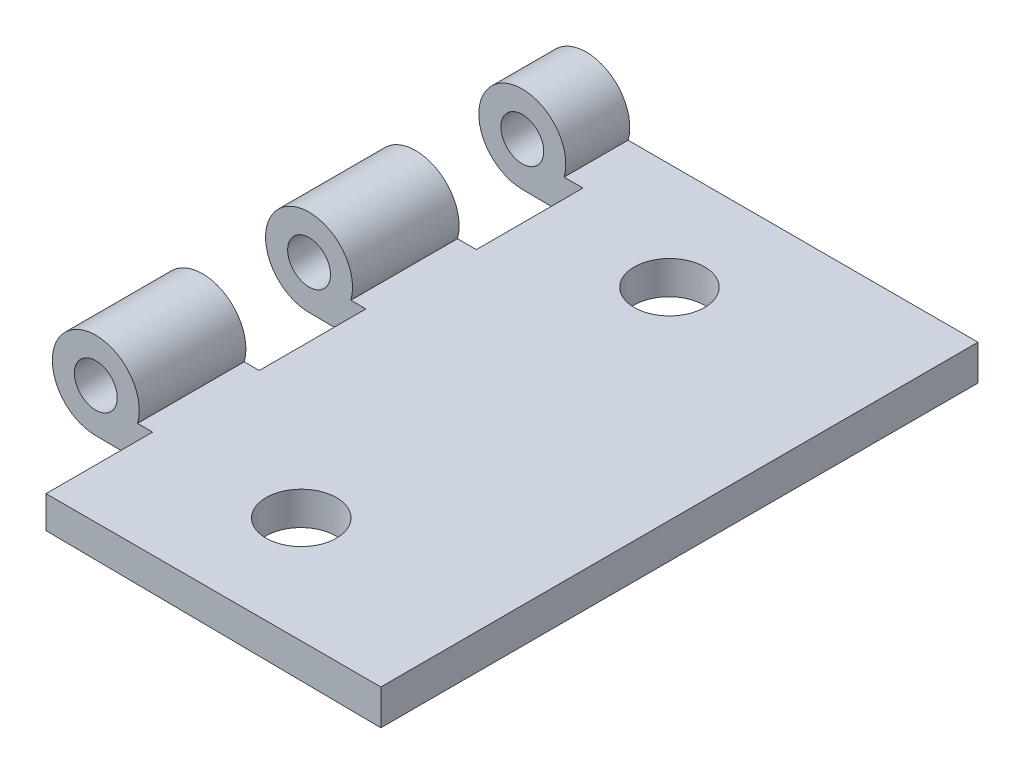
ISO-10303-21;
HEADER;
FILE_DESCRIPTION(('STEP AP214'),'2;1');
FILE_NAME('part.step','',(''),(''),'','','');
FILE_SCHEMA(('AUTOMOTIVE_DESIGN { 1 0 10303 214 1 1 1 1 }'));
ENDSEC;
DATA;
#1=APPLICATION_CONTEXT('core data for automotive mechanical design processes');
#2=APPLICATION_PROTOCOL_DEFINITION('international standard','automotive_design',2000,#1);
#3=PRODUCT_CONTEXT('',#1,'mechanical');
#4=PRODUCT('Part','Part','',(#3));
#5=PRODUCT_RELATED_PRODUCT_CATEGORY('part','',(#4));
#6=PRODUCT_DEFINITION_FORMATION('','',#4);
#7=PRODUCT_DEFINITION_CONTEXT('part definition',#1,'design');
#8=PRODUCT_DEFINITION('design','',#6,#7);
#9=PRODUCT_DEFINITION_SHAPE('','',#8);
#10=(LENGTH_UNIT() NAMED_UNIT(*) SI_UNIT(.MILLI.,.METRE.));
#11=(NAMED_UNIT(*) PLANE_ANGLE_UNIT() SI_UNIT($,.RADIAN.));
#12=(NAMED_UNIT(*) SI_UNIT($,.STERADIAN.) SOLID_ANGLE_UNIT());
#13=UNCERTAINTY_MEASURE_WITH_UNIT(LENGTH_MEASURE(1.E-05),#10,'distance_accuracy_value','');
#14=(GEOMETRIC_REPRESENTATION_CONTEXT(3) GLOBAL_UNCERTAINTY_ASSIGNED_CONTEXT((#13)) GLOBAL_UNIT_ASSIGNED_CONTEXT((#10,
#11,#12)) REPRESENTATION_CONTEXT('',''));
#15=CARTESIAN_POINT('',(0.,0.,0.));
#16=DIRECTION('',(0.,0.,1.));
#17=DIRECTION('',(1.,0.,0.));
#18=AXIS2_PLACEMENT_3D('',#15,#16,#17);
#19=CARTESIAN_POINT('',(0.,0.,280.));
#20=DIRECTION('',(0.,0.,1.));
#21=DIRECTION('',(1.,0.,0.));
#22=AXIS2_PLACEMENT_3D('',#19,#20,#21);
#23=PLANE('',#22);
#24=DIRECTION('',(-1.,0.,0.));
#25=VECTOR('',#24,1.);
#26=CARTESIAN_POINT('',(183.674687945951,-5.61723560223056,280.));
#27=LINE('',#26,#25);
#28=CARTESIAN_POINT('',(183.674687945951,-5.61723560223056,280.));
#29=VERTEX_POINT('',#28);
#30=CARTESIAN_POINT('',(26.6531917692704,-5.61723560223056,280.));
#31=VERTEX_POINT('',#30);
#32=EDGE_CURVE('E223',#29,#31,#27,.T.);
#33=ORIENTED_EDGE('',*,*,#32,.T.);
#34=DIRECTION('',(0.,1.,0.));
#35=VECTOR('',#34,1.);
#36=CARTESIAN_POINT('',(26.6531917692704,-22.2014549992922,280.));
#37=LINE('',#36,#35);
#38=CARTESIAN_POINT('',(26.6531917692704,-20.6503256305082,280.));
#39=VERTEX_POINT('',#38);
#40=EDGE_CURVE('E300',#39,#31,#37,.T.);
#41=ORIENTED_EDGE('',*,*,#40,.F.);
#42=DIRECTION('',(0.999951211660215,-0.00987797040229495,0.));
#43=VECTOR('',#42,1.);
#44=CARTESIAN_POINT('',(0.,-20.3870333454912,280.));
#45=LINE('',#44,#43);
#46=CARTESIAN_POINT('',(183.674687945951,-22.2014549992922,280.));
#47=VERTEX_POINT('',#46);
#48=EDGE_CURVE('E228',#39,#47,#45,.T.);
#49=ORIENTED_EDGE('',*,*,#48,.T.);
#50=DIRECTION('',(0.,1.,0.));
#51=VECTOR('',#50,1.);
#52=CARTESIAN_POINT('',(183.674687945951,-22.2014549992922,280.));
#53=LINE('',#52,#51);
#54=EDGE_CURVE('E219',#47,#29,#53,.T.);
#55=ORIENTED_EDGE('',*,*,#54,.T.);
#56=EDGE_LOOP('',(#33,#41,#49,#55));
#57=FACE_BOUND('',#56,.T.);
#58=ADVANCED_FACE('F59',(#57),#23,.T.);
#59=CARTESIAN_POINT('',(183.674687945951,-5.61723560223056,280.));
#60=DIRECTION('',(0.,-1.,0.));
#61=DIRECTION('',(0.,0.,-1.));
#62=AXIS2_PLACEMENT_3D('',#59,#60,#61);
#63=PLANE('',#62);
#64=CARTESIAN_POINT('',(96.3509650637546,-5.61723560223056,230.));
#65=DIRECTION('',(0.,1.,0.));
#66=DIRECTION('',(0.,0.,1.));
#67=AXIS2_PLACEMENT_3D('',#64,#65,#66);
#68=CIRCLE('',#67,16.5051294754292);
#69=CARTESIAN_POINT('',(96.3509650637546,-5.61723560223056,246.505129475429));
#70=VERTEX_POINT('',#69);
#71=EDGE_CURVE('E204',#70,#70,#68,.T.);
#72=ORIENTED_EDGE('',*,*,#71,.F.);
#73=EDGE_LOOP('',(#72));
#74=FACE_BOUND('',#73,.T.);
#75=CARTESIAN_POINT('',(88.9973961819924,-5.61723560223056,50.));
#76=DIRECTION('',(0.,1.,0.));
#77=DIRECTION('',(0.,0.,1.));
#78=AXIS2_PLACEMENT_3D('',#75,#76,#77);
#79=CIRCLE('',#78,16.5051294754292);
#80=CARTESIAN_POINT('',(88.9973961819924,-5.61723560223056,66.5051294754292));
#81=VERTEX_POINT('',#80);
#82=EDGE_CURVE('E205',#81,#81,#79,.T.);
#83=ORIENTED_EDGE('',*,*,#82,.F.);
#84=EDGE_LOOP('',(#83));
#85=FACE_BOUND('',#84,.T.);
#86=DIRECTION('',(-1.,0.,0.));
#87=VECTOR('',#86,1.);
#88=CARTESIAN_POINT('',(183.674687945951,-5.61723560223056,30.0000000000001));
#89=LINE('',#88,#87);
#90=CARTESIAN_POINT('',(28.4519508754233,-5.61723560223056,30.));
#91=VERTEX_POINT('',#90);
#92=CARTESIAN_POINT('',(19.597902765837,-5.61723560223056,30.0000000000001));
#93=VERTEX_POINT('',#92);
#94=EDGE_CURVE('E192',#91,#93,#89,.T.);
#95=ORIENTED_EDGE('',*,*,#94,.F.);
#96=DIRECTION('',(0.,0.,-1.));
#97=VECTOR('',#96,1.);
#98=CARTESIAN_POINT('',(28.4519508754233,-5.61723560223056,280.));
#99=LINE('',#98,#97);
#100=CARTESIAN_POINT('',(28.4519508754233,-5.61723560223056,80.0000000000001));
#101=VERTEX_POINT('',#100);
#102=EDGE_CURVE('E196',#101,#91,#99,.T.);
#103=ORIENTED_EDGE('',*,*,#102,.F.);
#104=DIRECTION('',(-1.,0.,0.));
#105=VECTOR('',#104,1.);
#106=CARTESIAN_POINT('',(183.674687945951,-5.61723560223056,80.0000000000001));
#107=LINE('',#106,#105);
#108=CARTESIAN_POINT('',(19.597902765837,-5.61723560223056,80.0000000000001));
#109=VERTEX_POINT('',#108);
#110=EDGE_CURVE('E294',#101,#109,#107,.T.);
#111=ORIENTED_EDGE('',*,*,#110,.T.);
#112=DIRECTION('',(0.,0.,-1.));
#113=VECTOR('',#112,1.);
#114=CARTESIAN_POINT('',(19.597902765837,-5.61723560223056,280.));
#115=LINE('',#114,#113);
#116=CARTESIAN_POINT('',(19.597902765837,-5.61723560223056,130.));
#117=VERTEX_POINT('',#116);
#118=EDGE_CURVE('E256',#117,#109,#115,.T.);
#119=ORIENTED_EDGE('',*,*,#118,.F.);
#120=DIRECTION('',(-1.,0.,0.));
#121=VECTOR('',#120,1.);
#122=CARTESIAN_POINT('',(183.674687945951,-5.61723560223056,130.));
#123=LINE('',#122,#121);
#124=CARTESIAN_POINT('',(26.6531917692704,-5.61723560223056,130.));
#125=VERTEX_POINT('',#124);
#126=EDGE_CURVE('E189',#125,#117,#123,.T.);
#127=ORIENTED_EDGE('',*,*,#126,.F.);
#128=DIRECTION('',(0.,0.,-1.));
#129=VECTOR('',#128,1.);
#130=CARTESIAN_POINT('',(26.6531917692704,-5.61723560223056,280.));
#131=LINE('',#130,#129);
#132=CARTESIAN_POINT('',(26.6531917692704,-5.61723560223056,180.));
#133=VERTEX_POINT('',#132);
#134=EDGE_CURVE('E177',#133,#125,#131,.T.);
#135=ORIENTED_EDGE('',*,*,#134,.F.);
#136=DIRECTION('',(-1.,0.,0.));
#137=VECTOR('',#136,1.);
#138=CARTESIAN_POINT('',(183.674687945951,-5.61723560223056,180.));
#139=LINE('',#138,#137);
#140=CARTESIAN_POINT('',(19.597902765837,-5.61723560223056,180.));
#141=VERTEX_POINT('',#140);
#142=EDGE_CURVE('E160',#133,#141,#139,.T.);
#143=ORIENTED_EDGE('',*,*,#142,.T.);
#144=CARTESIAN_POINT('',(19.597902765837,-5.61723560223056,230.));
#145=VERTEX_POINT('',#144);
#146=EDGE_CURVE('E257',#145,#141,#115,.T.);
#147=ORIENTED_EDGE('',*,*,#146,.F.);
#148=DIRECTION('',(-1.,0.,0.));
#149=VECTOR('',#148,1.);
#150=CARTESIAN_POINT('',(183.674687945951,-5.61723560223056,230.));
#151=LINE('',#150,#149);
#152=CARTESIAN_POINT('',(26.6531917692704,-5.61723560223056,230.));
#153=VERTEX_POINT('',#152);
#154=EDGE_CURVE('E288',#153,#145,#151,.T.);
#155=ORIENTED_EDGE('',*,*,#154,.F.);
#156=DIRECTION('',(0.,0.,-1.));
#157=VECTOR('',#156,1.);
#158=CARTESIAN_POINT('',(26.6531917692704,-5.61723560223056,280.));
#159=LINE('',#158,#157);
#160=EDGE_CURVE('E191',#31,#153,#159,.T.);
#161=ORIENTED_EDGE('',*,*,#160,.F.);
#162=ORIENTED_EDGE('',*,*,#32,.F.);
#163=DIRECTION('',(0.,0.,-1.));
#164=VECTOR('',#163,1.);
#165=CARTESIAN_POINT('',(183.674687945951,-5.61723560223056,280.));
#166=LINE('',#165,#164);
#167=CARTESIAN_POINT('',(183.674687945951,-5.61723560223056,0.));
#168=VERTEX_POINT('',#167);
#169=EDGE_CURVE('E258',#29,#168,#166,.T.);
#170=ORIENTED_EDGE('',*,*,#169,.T.);
#171=DIRECTION('',(-1.,0.,0.));
#172=VECTOR('',#171,1.);
#173=CARTESIAN_POINT('',(183.674687945951,-5.61723560223056,0.));
#174=LINE('',#173,#172);
#175=CARTESIAN_POINT('',(19.597902765837,-5.61723560223056,0.));
#176=VERTEX_POINT('',#175);
#177=EDGE_CURVE('E235',#168,#176,#174,.T.);
#178=ORIENTED_EDGE('',*,*,#177,.T.);
#179=EDGE_CURVE('E253',#93,#176,#115,.T.);
#180=ORIENTED_EDGE('',*,*,#179,.F.);
#181=EDGE_LOOP('',(#95,#103,#111,#119,#127,#135,#143,#147,#155,#161,#162,#170,#178,#180));
#182=FACE_BOUND('',#181,.T.);
#183=ADVANCED_FACE('F187',(#74,#85,#182),#63,.F.);
#184=CARTESIAN_POINT('',(0.,0.,280.));
#185=DIRECTION('',(0.,0.,-1.));
#186=DIRECTION('',(-1.,0.,0.));
#187=AXIS2_PLACEMENT_3D('',#184,#185,#186);
#188=CYLINDRICAL_SURFACE('',#187,20.3870333454912);
#189=DIRECTION('',(0.,0.,-1.));
#190=VECTOR('',#189,1.);
#191=CARTESIAN_POINT('',(0.,-20.3870333454912,280.));
#192=LINE('',#191,#190);
#193=CARTESIAN_POINT('',(0.,-20.3870333454912,30.0000000000001));
#194=VERTEX_POINT('',#193);
#195=CARTESIAN_POINT('',(0.,-20.3870333454912,0.));
#196=VERTEX_POINT('',#195);
#197=EDGE_CURVE('E248',#194,#196,#192,.T.);
#198=ORIENTED_EDGE('',*,*,#197,.F.);
#199=CARTESIAN_POINT('',(0.,0.,30.0000000000001));
#200=DIRECTION('',(0.,0.,1.));
#201=DIRECTION('',(1.,0.,0.));
#202=AXIS2_PLACEMENT_3D('',#199,#200,#201);
#203=CIRCLE('',#202,20.3870333454912);
#204=EDGE_CURVE('E198',#93,#194,#203,.T.);
#205=ORIENTED_EDGE('',*,*,#204,.F.);
#206=ORIENTED_EDGE('',*,*,#179,.T.);
#207=CARTESIAN_POINT('',(0.,0.,0.));
#208=DIRECTION('',(0.,0.,1.));
#209=DIRECTION('',(1.,0.,0.));
#210=AXIS2_PLACEMENT_3D('',#207,#208,#209);
#211=CIRCLE('',#210,20.3870333454912);
#212=EDGE_CURVE('E239',#176,#196,#211,.T.);
#213=ORIENTED_EDGE('',*,*,#212,.T.);
#214=EDGE_LOOP('',(#198,#205,#206,#213));
#215=FACE_BOUND('',#214,.T.);
#216=ADVANCED_FACE('F365',(#215),#188,.T.);
#217=CARTESIAN_POINT('',(0.,0.,80.0000000000001));
#218=DIRECTION('',(0.,0.,1.));
#219=DIRECTION('',(1.,0.,0.));
#220=AXIS2_PLACEMENT_3D('',#217,#218,#219);
#221=CIRCLE('',#220,20.3870333454912);
#222=CARTESIAN_POINT('',(0.,-20.3870333454912,80.0000000000001));
#223=VERTEX_POINT('',#222);
#224=EDGE_CURVE('E349',#109,#223,#221,.T.);
#225=ORIENTED_EDGE('',*,*,#224,.T.);
#226=CARTESIAN_POINT('',(0.,-20.3870333454912,130.));
#227=VERTEX_POINT('',#226);
#228=EDGE_CURVE('E251',#227,#223,#192,.T.);
#229=ORIENTED_EDGE('',*,*,#228,.F.);
#230=CARTESIAN_POINT('',(0.,0.,130.));
#231=DIRECTION('',(0.,0.,1.));
#232=DIRECTION('',(1.,0.,0.));
#233=AXIS2_PLACEMENT_3D('',#230,#231,#232);
#234=CIRCLE('',#233,20.3870333454912);
#235=EDGE_CURVE('E334',#117,#227,#234,.T.);
#236=ORIENTED_EDGE('',*,*,#235,.F.);
#237=ORIENTED_EDGE('',*,*,#118,.T.);
#238=EDGE_LOOP('',(#225,#229,#236,#237));
#239=FACE_BOUND('',#238,.T.);
#240=ADVANCED_FACE('F407',(#239),#188,.T.);
#241=CARTESIAN_POINT('',(0.,-20.3870333454912,230.));
#242=VERTEX_POINT('',#241);
#243=CARTESIAN_POINT('',(0.,-20.3870333454912,180.));
#244=VERTEX_POINT('',#243);
#245=EDGE_CURVE('E252',#242,#244,#192,.T.);
#246=ORIENTED_EDGE('',*,*,#245,.F.);
#247=CARTESIAN_POINT('',(0.,0.,230.));
#248=DIRECTION('',(0.,0.,1.));
#249=DIRECTION('',(1.,0.,0.));
#250=AXIS2_PLACEMENT_3D('',#247,#248,#249);
#251=CIRCLE('',#250,20.3870333454912);
#252=EDGE_CURVE('E341',#145,#242,#251,.T.);
#253=ORIENTED_EDGE('',*,*,#252,.F.);
#254=ORIENTED_EDGE('',*,*,#146,.T.);
#255=CARTESIAN_POINT('',(0.,0.,180.));
#256=DIRECTION('',(0.,0.,1.));
#257=DIRECTION('',(1.,0.,0.));
#258=AXIS2_PLACEMENT_3D('',#255,#256,#257);
#259=CIRCLE('',#258,20.3870333454912);
#260=EDGE_CURVE('E166',#141,#244,#259,.T.);
#261=ORIENTED_EDGE('',*,*,#260,.T.);
#262=EDGE_LOOP('',(#246,#253,#254,#261));
#263=FACE_BOUND('',#262,.T.);
#264=ADVANCED_FACE('F404',(#263),#188,.T.);
#265=CARTESIAN_POINT('',(0.,-20.3870333454912,280.));
#266=DIRECTION('',(0.00987797040229495,0.999951211660215,0.));
#267=DIRECTION('',(-0.999951211660215,0.00987797040229494,0.));
#268=AXIS2_PLACEMENT_3D('',#265,#266,#267);
#269=PLANE('',#268);
#270=CARTESIAN_POINT('',(96.3509650637546,-21.3388317632881,230.));
#271=DIRECTION('',(0.00987797040229495,0.999951211660215,0.));
#272=DIRECTION('',(-0.999951211660215,0.00987797040229494,0.));
#273=AXIS2_PLACEMENT_3D('',#270,#271,#272);
#274=ELLIPSE('',#273,16.5059347725834,16.5051294754292);
#275=CARTESIAN_POINT('',(79.8458355883254,-21.1757866281423,230.));
#276=VERTEX_POINT('',#275);
#277=EDGE_CURVE('E209',#276,#276,#274,.T.);
#278=ORIENTED_EDGE('',*,*,#277,.T.);
#279=EDGE_LOOP('',(#278));
#280=FACE_BOUND('',#279,.T.);
#281=CARTESIAN_POINT('',(88.9973961819924,-21.2661898834461,50.));
#282=DIRECTION('',(0.00987797040229495,0.999951211660215,0.));
#283=DIRECTION('',(-0.999951211660215,0.00987797040229494,0.));
#284=AXIS2_PLACEMENT_3D('',#281,#282,#283);
#285=ELLIPSE('',#284,16.5059347725834,16.5051294754292);
#286=CARTESIAN_POINT('',(72.4922667065631,-21.1031447483003,50.));
#287=VERTEX_POINT('',#286);
#288=EDGE_CURVE('E218',#287,#287,#285,.T.);
#289=ORIENTED_EDGE('',*,*,#288,.T.);
#290=EDGE_LOOP('',(#289));
#291=FACE_BOUND('',#290,.T.);
#292=DIRECTION('',(0.999951211660215,-0.00987797040229494,0.));
#293=VECTOR('',#292,1.);
#294=CARTESIAN_POINT('',(0.,-20.3870333454912,30.0000000000001));
#295=LINE('',#294,#293);
#296=CARTESIAN_POINT('',(28.4519508754233,-20.6680945866375,30.));
#297=VERTEX_POINT('',#296);
#298=EDGE_CURVE('E293',#194,#297,#295,.T.);
#299=ORIENTED_EDGE('',*,*,#298,.F.);
#300=ORIENTED_EDGE('',*,*,#197,.T.);
#301=DIRECTION('',(0.999951211660215,-0.00987797040229495,0.));
#302=VECTOR('',#301,1.);
#303=CARTESIAN_POINT('',(0.,-20.3870333454912,0.));
#304=LINE('',#303,#302);
#305=CARTESIAN_POINT('',(183.674687945951,-22.2014549992922,0.));
#306=VERTEX_POINT('',#305);
#307=EDGE_CURVE('E224',#196,#306,#304,.T.);
#308=ORIENTED_EDGE('',*,*,#307,.T.);
#309=DIRECTION('',(0.,0.,-1.));
#310=VECTOR('',#309,1.);
#311=CARTESIAN_POINT('',(183.674687945951,-22.2014549992922,280.));
#312=LINE('',#311,#310);
#313=EDGE_CURVE('E231',#47,#306,#312,.T.);
#314=ORIENTED_EDGE('',*,*,#313,.F.);
#315=ORIENTED_EDGE('',*,*,#48,.F.);
#316=DIRECTION('',(0.,0.,1.));
#317=VECTOR('',#316,1.);
#318=CARTESIAN_POINT('',(26.6531917692704,-20.6503256305082,280.));
#319=LINE('',#318,#317);
#320=CARTESIAN_POINT('',(26.6531917692704,-20.6503256305082,230.));
#321=VERTEX_POINT('',#320);
#322=EDGE_CURVE('E68',#321,#39,#319,.T.);
#323=ORIENTED_EDGE('',*,*,#322,.F.);
#324=DIRECTION('',(0.999951211660215,-0.00987797040229494,0.));
#325=VECTOR('',#324,1.);
#326=CARTESIAN_POINT('',(0.,-20.3870333454912,230.));
#327=LINE('',#326,#325);
#328=EDGE_CURVE('E282',#242,#321,#327,.T.);
#329=ORIENTED_EDGE('',*,*,#328,.F.);
#330=ORIENTED_EDGE('',*,*,#245,.T.);
#331=DIRECTION('',(0.999951211660215,-0.00987797040229494,0.));
#332=VECTOR('',#331,1.);
#333=CARTESIAN_POINT('',(0.,-20.3870333454912,180.));
#334=LINE('',#333,#332);
#335=CARTESIAN_POINT('',(26.6531917692704,-20.6503256305082,180.));
#336=VERTEX_POINT('',#335);
#337=EDGE_CURVE('E272',#244,#336,#334,.T.);
#338=ORIENTED_EDGE('',*,*,#337,.T.);
#339=DIRECTION('',(0.,0.,1.));
#340=VECTOR('',#339,1.);
#341=CARTESIAN_POINT('',(26.6531917692704,-20.6503256305082,280.));
#342=LINE('',#341,#340);
#343=CARTESIAN_POINT('',(26.6531917692704,-20.6503256305082,130.));
#344=VERTEX_POINT('',#343);
#345=EDGE_CURVE('E180',#344,#336,#342,.T.);
#346=ORIENTED_EDGE('',*,*,#345,.F.);
#347=DIRECTION('',(0.999951211660215,-0.00987797040229494,0.));
#348=VECTOR('',#347,1.);
#349=CARTESIAN_POINT('',(0.,-20.3870333454912,130.));
#350=LINE('',#349,#348);
#351=EDGE_CURVE('E277',#227,#344,#350,.T.);
#352=ORIENTED_EDGE('',*,*,#351,.F.);
#353=ORIENTED_EDGE('',*,*,#228,.T.);
#354=DIRECTION('',(0.999951211660215,-0.00987797040229494,0.));
#355=VECTOR('',#354,1.);
#356=CARTESIAN_POINT('',(0.,-20.3870333454912,80.0000000000001));
#357=LINE('',#356,#355);
#358=CARTESIAN_POINT('',(28.4519508754233,-20.6680945866375,80.0000000000001));
#359=VERTEX_POINT('',#358);
#360=EDGE_CURVE('E287',#223,#359,#357,.T.);
#361=ORIENTED_EDGE('',*,*,#360,.T.);
#362=DIRECTION('',(0.,0.,1.));
#363=VECTOR('',#362,1.);
#364=CARTESIAN_POINT('',(28.4519508754233,-20.6680945866375,280.));
#365=LINE('',#364,#363);
#366=EDGE_CURVE('E12',#297,#359,#365,.T.);
#367=ORIENTED_EDGE('',*,*,#366,.F.);
#368=EDGE_LOOP('',(#299,#300,#308,#314,#315,#323,#329,#330,#338,#346,#352,#353,#361,#367));
#369=FACE_BOUND('',#368,.T.);
#370=ADVANCED_FACE('F310',(#280,#291,#369),#269,.F.);
#371=CARTESIAN_POINT('',(0.,0.,280.));
#372=DIRECTION('',(0.,0.,-1.));
#373=DIRECTION('',(-1.,0.,0.));
#374=AXIS2_PLACEMENT_3D('',#371,#372,#373);
#375=CYLINDRICAL_SURFACE('',#374,10.0437475691042);
#376=CARTESIAN_POINT('',(0.,0.,0.));
#377=DIRECTION('',(0.,0.,1.));
#378=DIRECTION('',(1.,0.,0.));
#379=AXIS2_PLACEMENT_3D('',#376,#377,#378);
#380=CIRCLE('',#379,10.0437475691042);
#381=CARTESIAN_POINT('',(10.0437475691042,0.,0.));
#382=VERTEX_POINT('',#381);
#383=EDGE_CURVE('E213',#382,#382,#380,.T.);
#384=ORIENTED_EDGE('',*,*,#383,.F.);
#385=EDGE_LOOP('',(#384));
#386=FACE_BOUND('',#385,.T.);
#387=CARTESIAN_POINT('',(0.,0.,30.0000000000001));
#388=DIRECTION('',(0.,0.,1.));
#389=DIRECTION('',(1.,0.,0.));
#390=AXIS2_PLACEMENT_3D('',#387,#388,#389);
#391=CIRCLE('',#390,10.0437475691042);
#392=CARTESIAN_POINT('',(10.0437475691042,0.,30.0000000000001));
#393=VERTEX_POINT('',#392);
#394=EDGE_CURVE('E289',#393,#393,#391,.T.);
#395=ORIENTED_EDGE('',*,*,#394,.T.);
#396=EDGE_LOOP('',(#395));
#397=FACE_BOUND('',#396,.T.);
#398=ADVANCED_FACE('F370',(#386,#397),#375,.F.);
#399=CARTESIAN_POINT('',(0.,0.,0.));
#400=DIRECTION('',(0.,0.,1.));
#401=DIRECTION('',(1.,0.,0.));
#402=AXIS2_PLACEMENT_3D('',#399,#400,#401);
#403=PLANE('',#402);
#404=DIRECTION('',(0.,1.,0.));
#405=VECTOR('',#404,1.);
#406=CARTESIAN_POINT('',(183.674687945951,-22.2014549992922,0.));
#407=LINE('',#406,#405);
#408=EDGE_CURVE('E217',#306,#168,#407,.T.);
#409=ORIENTED_EDGE('',*,*,#408,.F.);
#410=ORIENTED_EDGE('',*,*,#307,.F.);
#411=ORIENTED_EDGE('',*,*,#212,.F.);
#412=ORIENTED_EDGE('',*,*,#177,.F.);
#413=EDGE_LOOP('',(#409,#410,#411,#412));
#414=FACE_BOUND('',#413,.T.);
#415=ORIENTED_EDGE('',*,*,#383,.T.);
#416=EDGE_LOOP('',(#415));
#417=FACE_BOUND('',#416,.T.);
#418=ADVANCED_FACE('F367',(#414,#417),#403,.F.);
#419=CARTESIAN_POINT('',(183.674687945951,-22.2014549992922,280.));
#420=DIRECTION('',(-1.,0.,0.));
#421=DIRECTION('',(0.,0.,1.));
#422=AXIS2_PLACEMENT_3D('',#419,#420,#421);
#423=PLANE('',#422);
#424=ORIENTED_EDGE('',*,*,#408,.T.);
#425=ORIENTED_EDGE('',*,*,#169,.F.);
#426=ORIENTED_EDGE('',*,*,#54,.F.);
#427=ORIENTED_EDGE('',*,*,#313,.T.);
#428=EDGE_LOOP('',(#424,#425,#426,#427));
#429=FACE_BOUND('',#428,.T.);
#430=ADVANCED_FACE('F61',(#429),#423,.F.);
#431=CARTESIAN_POINT('',(96.3509650637546,-22.2014549992922,230.));
#432=DIRECTION('',(0.,1.,0.));
#433=DIRECTION('',(0.,0.,1.));
#434=AXIS2_PLACEMENT_3D('',#431,#432,#433);
#435=CYLINDRICAL_SURFACE('',#434,16.5051294754292);
#436=ORIENTED_EDGE('',*,*,#71,.T.);
#437=EDGE_LOOP('',(#436));
#438=FACE_BOUND('',#437,.T.);
#439=ORIENTED_EDGE('',*,*,#277,.F.);
#440=EDGE_LOOP('',(#439));
#441=FACE_BOUND('',#440,.T.);
#442=ADVANCED_FACE('F448',(#438,#441),#435,.F.);
#443=CARTESIAN_POINT('',(88.9973961819924,-22.2014549992922,50.));
#444=DIRECTION('',(0.,1.,0.));
#445=DIRECTION('',(0.,0.,1.));
#446=AXIS2_PLACEMENT_3D('',#443,#444,#445);
#447=CYLINDRICAL_SURFACE('',#446,16.5051294754292);
#448=ORIENTED_EDGE('',*,*,#82,.T.);
#449=EDGE_LOOP('',(#448));
#450=FACE_BOUND('',#449,.T.);
#451=ORIENTED_EDGE('',*,*,#288,.F.);
#452=EDGE_LOOP('',(#451));
#453=FACE_BOUND('',#452,.T.);
#454=ADVANCED_FACE('F442',(#450,#453),#447,.F.);
#455=CARTESIAN_POINT('',(26.6531917692704,-22.2014549992922,130.));
#456=DIRECTION('',(-1.,0.,0.));
#457=DIRECTION('',(0.,0.,1.));
#458=AXIS2_PLACEMENT_3D('',#455,#456,#457);
#459=PLANE('',#458);
#460=ORIENTED_EDGE('',*,*,#134,.T.);
#461=DIRECTION('',(0.,1.,0.));
#462=VECTOR('',#461,1.);
#463=CARTESIAN_POINT('',(26.6531917692704,-22.2014549992922,130.));
#464=LINE('',#463,#462);
#465=EDGE_CURVE('E183',#344,#125,#464,.T.);
#466=ORIENTED_EDGE('',*,*,#465,.F.);
#467=ORIENTED_EDGE('',*,*,#345,.T.);
#468=DIRECTION('',(0.,1.,0.));
#469=VECTOR('',#468,1.);
#470=CARTESIAN_POINT('',(26.6531917692704,-22.2014549992922,180.));
#471=LINE('',#470,#469);
#472=EDGE_CURVE('E164',#336,#133,#471,.T.);
#473=ORIENTED_EDGE('',*,*,#472,.T.);
#474=EDGE_LOOP('',(#460,#466,#467,#473));
#475=FACE_BOUND('',#474,.T.);
#476=ADVANCED_FACE('F175',(#475),#459,.T.);
#477=CARTESIAN_POINT('',(-42.2135854377259,-22.2014549992922,130.));
#478=DIRECTION('',(0.,0.,1.));
#479=DIRECTION('',(1.,0.,0.));
#480=AXIS2_PLACEMENT_3D('',#477,#478,#479);
#481=PLANE('',#480);
#482=CARTESIAN_POINT('',(0.,0.,130.));
#483=DIRECTION('',(0.,0.,1.));
#484=DIRECTION('',(1.,0.,0.));
#485=AXIS2_PLACEMENT_3D('',#482,#483,#484);
#486=CIRCLE('',#485,10.0437475691042);
#487=CARTESIAN_POINT('',(10.0437475691042,0.,130.));
#488=VERTEX_POINT('',#487);
#489=EDGE_CURVE('E172',#488,#488,#486,.T.);
#490=ORIENTED_EDGE('',*,*,#489,.F.);
#491=EDGE_LOOP('',(#490));
#492=FACE_BOUND('',#491,.T.);
#493=ORIENTED_EDGE('',*,*,#126,.T.);
#494=ORIENTED_EDGE('',*,*,#235,.T.);
#495=ORIENTED_EDGE('',*,*,#351,.T.);
#496=ORIENTED_EDGE('',*,*,#465,.T.);
#497=EDGE_LOOP('',(#493,#494,#495,#496));
#498=FACE_BOUND('',#497,.T.);
#499=ADVANCED_FACE('F432',(#492,#498),#481,.T.);
#500=CARTESIAN_POINT('',(-42.2135854377259,-22.2014549992922,180.));
#501=DIRECTION('',(0.,0.,1.));
#502=DIRECTION('',(1.,0.,0.));
#503=AXIS2_PLACEMENT_3D('',#500,#501,#502);
#504=PLANE('',#503);
#505=CARTESIAN_POINT('',(0.,0.,180.));
#506=DIRECTION('',(0.,0.,1.));
#507=DIRECTION('',(1.,0.,0.));
#508=AXIS2_PLACEMENT_3D('',#505,#506,#507);
#509=CIRCLE('',#508,10.0437475691042);
#510=CARTESIAN_POINT('',(10.0437475691042,0.,180.));
#511=VERTEX_POINT('',#510);
#512=EDGE_CURVE('E268',#511,#511,#509,.T.);
#513=ORIENTED_EDGE('',*,*,#512,.T.);
#514=EDGE_LOOP('',(#513));
#515=FACE_BOUND('',#514,.T.);
#516=ORIENTED_EDGE('',*,*,#472,.F.);
#517=ORIENTED_EDGE('',*,*,#337,.F.);
#518=ORIENTED_EDGE('',*,*,#260,.F.);
#519=ORIENTED_EDGE('',*,*,#142,.F.);
#520=EDGE_LOOP('',(#516,#517,#518,#519));
#521=FACE_BOUND('',#520,.T.);
#522=ADVANCED_FACE('F162',(#515,#521),#504,.F.);
#523=CARTESIAN_POINT('',(0.,0.,80.0000000000001));
#524=DIRECTION('',(0.,0.,1.));
#525=DIRECTION('',(1.,0.,0.));
#526=AXIS2_PLACEMENT_3D('',#523,#524,#525);
#527=CIRCLE('',#526,10.0437475691042);
#528=CARTESIAN_POINT('',(10.0437475691042,0.,80.0000000000001));
#529=VERTEX_POINT('',#528);
#530=EDGE_CURVE('E283',#529,#529,#527,.T.);
#531=ORIENTED_EDGE('',*,*,#530,.F.);
#532=EDGE_LOOP('',(#531));
#533=FACE_BOUND('',#532,.T.);
#534=ORIENTED_EDGE('',*,*,#489,.T.);
#535=EDGE_LOOP('',(#534));
#536=FACE_BOUND('',#535,.T.);
#537=ADVANCED_FACE('F378',(#533,#536),#375,.F.);
#538=CARTESIAN_POINT('',(26.6531917692704,-22.2014549992922,230.));
#539=DIRECTION('',(-1.,0.,0.));
#540=DIRECTION('',(0.,0.,1.));
#541=AXIS2_PLACEMENT_3D('',#538,#539,#540);
#542=PLANE('',#541);
#543=ORIENTED_EDGE('',*,*,#160,.T.);
#544=DIRECTION('',(0.,1.,0.));
#545=VECTOR('',#544,1.);
#546=CARTESIAN_POINT('',(26.6531917692704,-22.2014549992922,230.));
#547=LINE('',#546,#545);
#548=EDGE_CURVE('E82',#321,#153,#547,.T.);
#549=ORIENTED_EDGE('',*,*,#548,.F.);
#550=ORIENTED_EDGE('',*,*,#322,.T.);
#551=ORIENTED_EDGE('',*,*,#40,.T.);
#552=EDGE_LOOP('',(#543,#549,#550,#551));
#553=FACE_BOUND('',#552,.T.);
#554=ADVANCED_FACE('F299',(#553),#542,.T.);
#555=CARTESIAN_POINT('',(-42.2135854377259,-22.2014549992922,230.));
#556=DIRECTION('',(0.,0.,1.));
#557=DIRECTION('',(1.,0.,0.));
#558=AXIS2_PLACEMENT_3D('',#555,#556,#557);
#559=PLANE('',#558);
#560=CARTESIAN_POINT('',(0.,0.,230.));
#561=DIRECTION('',(0.,0.,1.));
#562=DIRECTION('',(1.,0.,0.));
#563=AXIS2_PLACEMENT_3D('',#560,#561,#562);
#564=CIRCLE('',#563,10.0437475691042);
#565=CARTESIAN_POINT('',(10.0437475691042,0.,230.));
#566=VERTEX_POINT('',#565);
#567=EDGE_CURVE('E278',#566,#566,#564,.T.);
#568=ORIENTED_EDGE('',*,*,#567,.F.);
#569=EDGE_LOOP('',(#568));
#570=FACE_BOUND('',#569,.T.);
#571=ORIENTED_EDGE('',*,*,#154,.T.);
#572=ORIENTED_EDGE('',*,*,#252,.T.);
#573=ORIENTED_EDGE('',*,*,#328,.T.);
#574=ORIENTED_EDGE('',*,*,#548,.T.);
#575=EDGE_LOOP('',(#571,#572,#573,#574));
#576=FACE_BOUND('',#575,.T.);
#577=ADVANCED_FACE('F320',(#570,#576),#559,.T.);
#578=CARTESIAN_POINT('',(28.4519508754233,-22.2014549992922,30.));
#579=DIRECTION('',(-1.,0.,0.));
#580=DIRECTION('',(0.,0.,1.));
#581=AXIS2_PLACEMENT_3D('',#578,#579,#580);
#582=PLANE('',#581);
#583=ORIENTED_EDGE('',*,*,#102,.T.);
#584=DIRECTION('',(0.,1.,0.));
#585=VECTOR('',#584,1.);
#586=CARTESIAN_POINT('',(28.4519508754233,-22.2014549992922,30.));
#587=LINE('',#586,#585);
#588=EDGE_CURVE('E273',#297,#91,#587,.T.);
#589=ORIENTED_EDGE('',*,*,#588,.F.);
#590=ORIENTED_EDGE('',*,*,#366,.T.);
#591=DIRECTION('',(0.,1.,0.));
#592=VECTOR('',#591,1.);
#593=CARTESIAN_POINT('',(28.4519508754233,-22.2014549992922,80.0000000000001));
#594=LINE('',#593,#592);
#595=EDGE_CURVE('E75',#359,#101,#594,.T.);
#596=ORIENTED_EDGE('',*,*,#595,.T.);
#597=EDGE_LOOP('',(#583,#589,#590,#596));
#598=FACE_BOUND('',#597,.T.);
#599=ADVANCED_FACE('F383',(#598),#582,.T.);
#600=CARTESIAN_POINT('',(-42.2135854377259,-22.2014549992922,30.0000000000001));
#601=DIRECTION('',(0.,0.,1.));
#602=DIRECTION('',(1.,0.,0.));
#603=AXIS2_PLACEMENT_3D('',#600,#601,#602);
#604=PLANE('',#603);
#605=ORIENTED_EDGE('',*,*,#394,.F.);
#606=EDGE_LOOP('',(#605));
#607=FACE_BOUND('',#606,.T.);
#608=ORIENTED_EDGE('',*,*,#94,.T.);
#609=ORIENTED_EDGE('',*,*,#204,.T.);
#610=ORIENTED_EDGE('',*,*,#298,.T.);
#611=ORIENTED_EDGE('',*,*,#588,.T.);
#612=EDGE_LOOP('',(#608,#609,#610,#611));
#613=FACE_BOUND('',#612,.T.);
#614=ADVANCED_FACE('F359',(#607,#613),#604,.T.);
#615=CARTESIAN_POINT('',(-42.2135854377259,-22.2014549992922,80.0000000000001));
#616=DIRECTION('',(0.,0.,1.));
#617=DIRECTION('',(1.,0.,0.));
#618=AXIS2_PLACEMENT_3D('',#615,#616,#617);
#619=PLANE('',#618);
#620=ORIENTED_EDGE('',*,*,#530,.T.);
#621=EDGE_LOOP('',(#620));
#622=FACE_BOUND('',#621,.T.);
#623=ORIENTED_EDGE('',*,*,#595,.F.);
#624=ORIENTED_EDGE('',*,*,#360,.F.);
#625=ORIENTED_EDGE('',*,*,#224,.F.);
#626=ORIENTED_EDGE('',*,*,#110,.F.);
#627=EDGE_LOOP('',(#623,#624,#625,#626));
#628=FACE_BOUND('',#627,.T.);
#629=ADVANCED_FACE('F382',(#622,#628),#619,.F.);
#630=ORIENTED_EDGE('',*,*,#512,.F.);
#631=EDGE_LOOP('',(#630));
#632=FACE_BOUND('',#631,.T.);
#633=ORIENTED_EDGE('',*,*,#567,.T.);
#634=EDGE_LOOP('',(#633));
#635=FACE_BOUND('',#634,.T.);
#636=ADVANCED_FACE('F377',(#632,#635),#375,.F.);
#637=CLOSED_SHELL('',(#58,#183,#216,#240,#264,#370,#398,#418,#430,#442,#454,#476,#499,#522,#537,
#554,#577,#599,#614,#629,#636));
#638=MANIFOLD_SOLID_BREP('B2',#637);
#639=ADVANCED_BREP_SHAPE_REPRESENTATION('',(#18,#638),#14);
#640=SHAPE_DEFINITION_REPRESENTATION(#9,#639);
ENDSEC;
END-ISO-10303-21;
